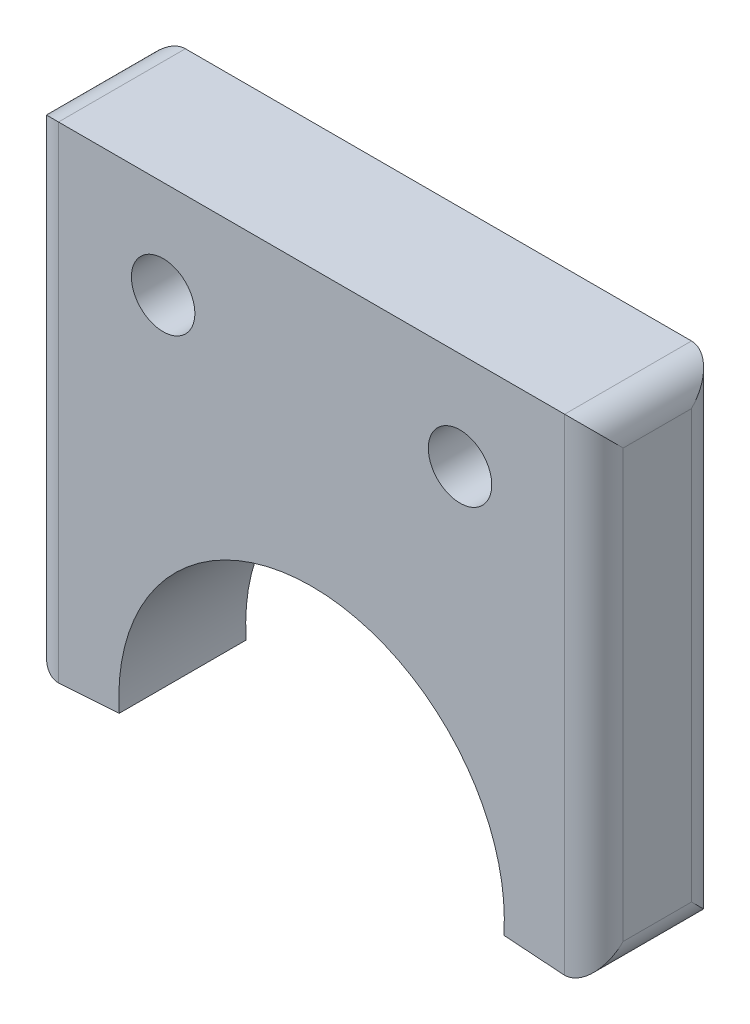
ISO-10303-21;
HEADER;
FILE_DESCRIPTION(('STEP AP214'),'2;1');
FILE_NAME('part.step','',(''),(''),'','','');
FILE_SCHEMA(('AUTOMOTIVE_DESIGN { 1 0 10303 214 1 1 1 1 }'));
ENDSEC;
DATA;
#1=APPLICATION_CONTEXT('core data for automotive mechanical design processes');
#2=APPLICATION_PROTOCOL_DEFINITION('international standard','automotive_design',2000,#1);
#3=PRODUCT_CONTEXT('',#1,'mechanical');
#4=PRODUCT('Part','Part','',(#3));
#5=PRODUCT_RELATED_PRODUCT_CATEGORY('part','',(#4));
#6=PRODUCT_DEFINITION_FORMATION('','',#4);
#7=PRODUCT_DEFINITION_CONTEXT('part definition',#1,'design');
#8=PRODUCT_DEFINITION('design','',#6,#7);
#9=PRODUCT_DEFINITION_SHAPE('','',#8);
#10=(LENGTH_UNIT() NAMED_UNIT(*) SI_UNIT(.MILLI.,.METRE.));
#11=(NAMED_UNIT(*) PLANE_ANGLE_UNIT() SI_UNIT($,.RADIAN.));
#12=(NAMED_UNIT(*) SI_UNIT($,.STERADIAN.) SOLID_ANGLE_UNIT());
#13=UNCERTAINTY_MEASURE_WITH_UNIT(LENGTH_MEASURE(1.E-05),#10,'distance_accuracy_value','');
#14=(GEOMETRIC_REPRESENTATION_CONTEXT(3) GLOBAL_UNCERTAINTY_ASSIGNED_CONTEXT((#13)) GLOBAL_UNIT_ASSIGNED_CONTEXT((#10,
#11,#12)) REPRESENTATION_CONTEXT('',''));
#15=CARTESIAN_POINT('',(0.,0.,0.));
#16=DIRECTION('',(0.,0.,1.));
#17=DIRECTION('',(1.,0.,0.));
#18=AXIS2_PLACEMENT_3D('',#15,#16,#17);
#19=CARTESIAN_POINT('',(0.,0.,13.));
#20=DIRECTION('',(0.,0.,1.));
#21=DIRECTION('',(1.,0.,0.));
#22=AXIS2_PLACEMENT_3D('',#19,#20,#21);
#23=PLANE('',#22);
#24=CARTESIAN_POINT('',(15.2099216455985,37.9770622614203,13.));
#25=DIRECTION('',(0.,0.,1.));
#26=DIRECTION('',(1.,0.,0.));
#27=AXIS2_PLACEMENT_3D('',#24,#25,#26);
#28=CIRCLE('',#27,3.25);
#29=CARTESIAN_POINT('',(11.9599216455985,37.9770622614203,13.));
#30=VERTEX_POINT('',#29);
#31=EDGE_CURVE('E236',#30,#30,#28,.T.);
#32=ORIENTED_EDGE('',*,*,#31,.F.);
#33=EDGE_LOOP('',(#32));
#34=FACE_BOUND('',#33,.T.);
#35=DIRECTION('',(-1.,0.,0.));
#36=VECTOR('',#35,1.);
#37=CARTESIAN_POINT('',(-28.9293574575349,47.9770622614203,13.));
#38=LINE('',#37,#36);
#39=CARTESIAN_POINT('',(25.9293574575349,47.9770622614203,13.));
#40=VERTEX_POINT('',#39);
#41=CARTESIAN_POINT('',(-25.9293574575349,47.9770622614203,13.));
#42=VERTEX_POINT('',#41);
#43=EDGE_CURVE('E133',#40,#42,#38,.T.);
#44=ORIENTED_EDGE('',*,*,#43,.T.);
#45=DIRECTION('',(0.,-1.,0.));
#46=VECTOR('',#45,1.);
#47=CARTESIAN_POINT('',(-25.9293574575349,-2.02293773857974,13.));
#48=LINE('',#47,#46);
#49=CARTESIAN_POINT('',(-25.9293574575349,-1.80583160850568,13.));
#50=VERTEX_POINT('',#49);
#51=EDGE_CURVE('E174',#42,#50,#48,.T.);
#52=ORIENTED_EDGE('',*,*,#51,.T.);
#53=CARTESIAN_POINT('',(-25.9293574575349,1.19416839149432,13.));
#54=DIRECTION('',(0.,0.,1.));
#55=DIRECTION('',(1.,0.,0.));
#56=AXIS2_PLACEMENT_3D('',#53,#54,#55);
#57=CIRCLE('',#56,3.);
#58=CARTESIAN_POINT('',(-25.7200880363025,-1.79852375928516,13.));
#59=VERTEX_POINT('',#58);
#60=EDGE_CURVE('E172',#50,#59,#57,.T.);
#61=ORIENTED_EDGE('',*,*,#60,.T.);
#62=DIRECTION('',(0.997564050259824,0.0697564737441291,0.));
#63=VECTOR('',#62,1.);
#64=CARTESIAN_POINT('',(-19.7018899926315,-1.37769035644655,13.));
#65=LINE('',#64,#63);
#66=CARTESIAN_POINT('',(-19.7018899926315,-1.37769035644655,13.));
#67=VERTEX_POINT('',#66);
#68=EDGE_CURVE('E140',#59,#67,#65,.T.);
#69=ORIENTED_EDGE('',*,*,#68,.T.);
#70=CARTESIAN_POINT('',(0.,0.,13.));
#71=DIRECTION('',(0.,0.,-1.));
#72=DIRECTION('',(1.,0.,0.));
#73=AXIS2_PLACEMENT_3D('',#70,#71,#72);
#74=CIRCLE('',#73,19.75);
#75=CARTESIAN_POINT('',(19.7018899926315,-1.37769035644655,13.));
#76=VERTEX_POINT('',#75);
#77=EDGE_CURVE('E134',#67,#76,#74,.T.);
#78=ORIENTED_EDGE('',*,*,#77,.T.);
#79=DIRECTION('',(0.997564050259824,-0.0697564737441291,0.));
#80=VECTOR('',#79,1.);
#81=CARTESIAN_POINT('',(19.7018899926315,-1.37769035644655,13.));
#82=LINE('',#81,#80);
#83=CARTESIAN_POINT('',(25.7200880363025,-1.79852375928516,13.));
#84=VERTEX_POINT('',#83);
#85=EDGE_CURVE('E124',#76,#84,#82,.T.);
#86=ORIENTED_EDGE('',*,*,#85,.T.);
#87=CARTESIAN_POINT('',(25.9293574575349,1.19416839149432,13.));
#88=DIRECTION('',(0.,0.,1.));
#89=DIRECTION('',(1.,0.,0.));
#90=AXIS2_PLACEMENT_3D('',#87,#88,#89);
#91=CIRCLE('',#90,3.);
#92=CARTESIAN_POINT('',(25.9293574575349,-1.80583160850568,13.));
#93=VERTEX_POINT('',#92);
#94=EDGE_CURVE('E170',#84,#93,#91,.T.);
#95=ORIENTED_EDGE('',*,*,#94,.T.);
#96=DIRECTION('',(0.,1.,0.));
#97=VECTOR('',#96,1.);
#98=CARTESIAN_POINT('',(25.9293574575349,47.9770622614203,13.));
#99=LINE('',#98,#97);
#100=EDGE_CURVE('E168',#93,#40,#99,.T.);
#101=ORIENTED_EDGE('',*,*,#100,.T.);
#102=EDGE_LOOP('',(#44,#52,#61,#69,#78,#86,#95,#101));
#103=FACE_BOUND('',#102,.T.);
#104=CARTESIAN_POINT('',(-15.2099216455985,37.9770622614203,13.));
#105=DIRECTION('',(0.,0.,1.));
#106=DIRECTION('',(-1.,0.,0.));
#107=AXIS2_PLACEMENT_3D('',#104,#105,#106);
#108=CIRCLE('',#107,3.25);
#109=CARTESIAN_POINT('',(-18.4599216455985,37.9770622614203,13.));
#110=VERTEX_POINT('',#109);
#111=EDGE_CURVE('E242',#110,#110,#108,.T.);
#112=ORIENTED_EDGE('',*,*,#111,.F.);
#113=EDGE_LOOP('',(#112));
#114=FACE_BOUND('',#113,.T.);
#115=ADVANCED_FACE('F33',(#34,#103,#114),#23,.T.);
#116=CARTESIAN_POINT('',(0.,0.,0.));
#117=DIRECTION('',(0.,0.,1.));
#118=DIRECTION('',(1.,0.,0.));
#119=AXIS2_PLACEMENT_3D('',#116,#117,#118);
#120=PLANE('',#119);
#121=DIRECTION('',(0.997564050259824,0.0697564737441291,0.));
#122=VECTOR('',#121,1.);
#123=CARTESIAN_POINT('',(-19.7018899926315,-1.37769035644655,0.));
#124=LINE('',#123,#122);
#125=CARTESIAN_POINT('',(-25.7200880363025,-1.79852375928516,0.));
#126=VERTEX_POINT('',#125);
#127=CARTESIAN_POINT('',(-19.7018899926315,-1.37769035644655,0.));
#128=VERTEX_POINT('',#127);
#129=EDGE_CURVE('E144',#126,#128,#124,.T.);
#130=ORIENTED_EDGE('',*,*,#129,.F.);
#131=CARTESIAN_POINT('',(-25.9293574575349,1.19416839149432,0.));
#132=DIRECTION('',(0.,0.,1.));
#133=DIRECTION('',(1.,0.,0.));
#134=AXIS2_PLACEMENT_3D('',#131,#132,#133);
#135=CIRCLE('',#134,3.);
#136=CARTESIAN_POINT('',(-25.9293574575349,-1.80583160850568,0.));
#137=VERTEX_POINT('',#136);
#138=EDGE_CURVE('E184',#126,#137,#135,.F.);
#139=ORIENTED_EDGE('',*,*,#138,.T.);
#140=DIRECTION('',(0.,-1.,0.));
#141=VECTOR('',#140,1.);
#142=CARTESIAN_POINT('',(-25.9293574575349,0.,0.));
#143=LINE('',#142,#141);
#144=CARTESIAN_POINT('',(-25.9293574575349,47.9770622614203,0.));
#145=VERTEX_POINT('',#144);
#146=EDGE_CURVE('E182',#137,#145,#143,.F.);
#147=ORIENTED_EDGE('',*,*,#146,.T.);
#148=DIRECTION('',(-1.,0.,0.));
#149=VECTOR('',#148,1.);
#150=CARTESIAN_POINT('',(-28.9293574575349,47.9770622614203,0.));
#151=LINE('',#150,#149);
#152=CARTESIAN_POINT('',(25.9293574575349,47.9770622614203,0.));
#153=VERTEX_POINT('',#152);
#154=EDGE_CURVE('E223',#153,#145,#151,.T.);
#155=ORIENTED_EDGE('',*,*,#154,.F.);
#156=DIRECTION('',(0.,1.,0.));
#157=VECTOR('',#156,1.);
#158=CARTESIAN_POINT('',(25.9293574575349,0.,0.));
#159=LINE('',#158,#157);
#160=CARTESIAN_POINT('',(25.9293574575349,-1.80583160850568,0.));
#161=VERTEX_POINT('',#160);
#162=EDGE_CURVE('E178',#153,#161,#159,.F.);
#163=ORIENTED_EDGE('',*,*,#162,.T.);
#164=CARTESIAN_POINT('',(25.9293574575349,1.19416839149432,0.));
#165=DIRECTION('',(0.,0.,1.));
#166=DIRECTION('',(1.,0.,0.));
#167=AXIS2_PLACEMENT_3D('',#164,#165,#166);
#168=CIRCLE('',#167,3.);
#169=CARTESIAN_POINT('',(25.7200880363025,-1.79852375928516,0.));
#170=VERTEX_POINT('',#169);
#171=EDGE_CURVE('E180',#161,#170,#168,.F.);
#172=ORIENTED_EDGE('',*,*,#171,.T.);
#173=DIRECTION('',(0.997564050259824,-0.0697564737441291,0.));
#174=VECTOR('',#173,1.);
#175=CARTESIAN_POINT('',(19.7018899926315,-1.37769035644655,0.));
#176=LINE('',#175,#174);
#177=CARTESIAN_POINT('',(19.7018899926315,-1.37769035644655,0.));
#178=VERTEX_POINT('',#177);
#179=EDGE_CURVE('E231',#178,#170,#176,.T.);
#180=ORIENTED_EDGE('',*,*,#179,.F.);
#181=CARTESIAN_POINT('',(0.,0.,0.));
#182=DIRECTION('',(0.,0.,-1.));
#183=DIRECTION('',(1.,0.,0.));
#184=AXIS2_PLACEMENT_3D('',#181,#182,#183);
#185=CIRCLE('',#184,19.75);
#186=EDGE_CURVE('E148',#128,#178,#185,.T.);
#187=ORIENTED_EDGE('',*,*,#186,.F.);
#188=EDGE_LOOP('',(#130,#139,#147,#155,#163,#172,#180,#187));
#189=FACE_BOUND('',#188,.T.);
#190=CARTESIAN_POINT('',(15.2099216455985,37.9770622614203,0.));
#191=DIRECTION('',(0.,0.,1.));
#192=DIRECTION('',(1.,0.,0.));
#193=AXIS2_PLACEMENT_3D('',#190,#191,#192);
#194=CIRCLE('',#193,3.25);
#195=CARTESIAN_POINT('',(11.9599216455985,37.9770622614203,0.));
#196=VERTEX_POINT('',#195);
#197=EDGE_CURVE('E239',#196,#196,#194,.T.);
#198=ORIENTED_EDGE('',*,*,#197,.T.);
#199=EDGE_LOOP('',(#198));
#200=FACE_BOUND('',#199,.T.);
#201=CARTESIAN_POINT('',(-15.2099216455985,37.9770622614203,0.));
#202=DIRECTION('',(0.,0.,1.));
#203=DIRECTION('',(-1.,0.,0.));
#204=AXIS2_PLACEMENT_3D('',#201,#202,#203);
#205=CIRCLE('',#204,3.25);
#206=CARTESIAN_POINT('',(-18.4599216455985,37.9770622614203,0.));
#207=VERTEX_POINT('',#206);
#208=EDGE_CURVE('E201',#207,#207,#205,.T.);
#209=ORIENTED_EDGE('',*,*,#208,.T.);
#210=EDGE_LOOP('',(#209));
#211=FACE_BOUND('',#210,.T.);
#212=ADVANCED_FACE('F227',(#189,#200,#211),#120,.F.);
#213=CARTESIAN_POINT('',(0.,0.,13.));
#214=DIRECTION('',(0.,0.,-1.));
#215=DIRECTION('',(-1.,0.,0.));
#216=AXIS2_PLACEMENT_3D('',#213,#214,#215);
#217=CYLINDRICAL_SURFACE('',#216,19.75);
#218=ORIENTED_EDGE('',*,*,#186,.T.);
#219=DIRECTION('',(0.,0.,-1.));
#220=VECTOR('',#219,1.);
#221=CARTESIAN_POINT('',(19.7018899926315,-1.37769035644655,13.));
#222=LINE('',#221,#220);
#223=EDGE_CURVE('E129',#76,#178,#222,.T.);
#224=ORIENTED_EDGE('',*,*,#223,.F.);
#225=ORIENTED_EDGE('',*,*,#77,.F.);
#226=DIRECTION('',(0.,0.,-1.));
#227=VECTOR('',#226,1.);
#228=CARTESIAN_POINT('',(-19.7018899926315,-1.37769035644655,13.));
#229=LINE('',#228,#227);
#230=EDGE_CURVE('E150',#67,#128,#229,.T.);
#231=ORIENTED_EDGE('',*,*,#230,.T.);
#232=EDGE_LOOP('',(#218,#224,#225,#231));
#233=FACE_BOUND('',#232,.T.);
#234=ADVANCED_FACE('F146',(#233),#217,.F.);
#235=CARTESIAN_POINT('',(19.7018899926315,-1.37769035644655,13.));
#236=DIRECTION('',(0.0697564737441291,0.997564050259824,0.));
#237=DIRECTION('',(-0.997564050259824,0.0697564737441291,0.));
#238=AXIS2_PLACEMENT_3D('',#235,#236,#237);
#239=PLANE('',#238);
#240=ORIENTED_EDGE('',*,*,#179,.T.);
#241=DIRECTION('',(0.,0.,-1.));
#242=VECTOR('',#241,1.);
#243=CARTESIAN_POINT('',(25.7200880363025,-1.79852375928516,13.));
#244=LINE('',#243,#242);
#245=EDGE_CURVE('E11',#170,#84,#244,.F.);
#246=ORIENTED_EDGE('',*,*,#245,.T.);
#247=ORIENTED_EDGE('',*,*,#85,.F.);
#248=ORIENTED_EDGE('',*,*,#223,.T.);
#249=EDGE_LOOP('',(#240,#246,#247,#248));
#250=FACE_BOUND('',#249,.T.);
#251=ADVANCED_FACE('F127',(#250),#239,.F.);
#252=CARTESIAN_POINT('',(28.9293574575349,-2.02293773857974,13.));
#253=DIRECTION('',(-1.,0.,0.));
#254=DIRECTION('',(0.,0.,1.));
#255=AXIS2_PLACEMENT_3D('',#252,#253,#254);
#256=PLANE('',#255);
#257=DIRECTION('',(0.,1.,0.));
#258=VECTOR('',#257,1.);
#259=CARTESIAN_POINT('',(28.9293574575349,-2.02293773857974,10.));
#260=LINE('',#259,#258);
#261=CARTESIAN_POINT('',(28.9293574575349,44.9770622614203,10.));
#262=VERTEX_POINT('',#261);
#263=CARTESIAN_POINT('',(28.9293574575349,1.19416839149432,10.));
#264=VERTEX_POINT('',#263);
#265=EDGE_CURVE('E50',#262,#264,#260,.F.);
#266=ORIENTED_EDGE('',*,*,#265,.T.);
#267=DIRECTION('',(0.,0.,-1.));
#268=VECTOR('',#267,1.);
#269=CARTESIAN_POINT('',(28.9293574575349,1.19416839149432,13.));
#270=LINE('',#269,#268);
#271=CARTESIAN_POINT('',(28.9293574575349,1.19416839149432,3.));
#272=VERTEX_POINT('',#271);
#273=EDGE_CURVE('E42',#264,#272,#270,.T.);
#274=ORIENTED_EDGE('',*,*,#273,.T.);
#275=DIRECTION('',(0.,1.,0.));
#276=VECTOR('',#275,1.);
#277=CARTESIAN_POINT('',(28.9293574575349,-2.02293773857974,3.));
#278=LINE('',#277,#276);
#279=CARTESIAN_POINT('',(28.9293574575349,44.9770622614203,3.));
#280=VERTEX_POINT('',#279);
#281=EDGE_CURVE('E186',#272,#280,#278,.T.);
#282=ORIENTED_EDGE('',*,*,#281,.T.);
#283=DIRECTION('',(0.,0.,-1.));
#284=VECTOR('',#283,1.);
#285=CARTESIAN_POINT('',(28.9293574575349,44.9770622614203,13.));
#286=LINE('',#285,#284);
#287=EDGE_CURVE('E55',#280,#262,#286,.F.);
#288=ORIENTED_EDGE('',*,*,#287,.T.);
#289=EDGE_LOOP('',(#266,#274,#282,#288));
#290=FACE_BOUND('',#289,.T.);
#291=ADVANCED_FACE('F274',(#290),#256,.F.);
#292=CARTESIAN_POINT('',(-28.9293574575349,47.9770622614203,13.));
#293=DIRECTION('',(0.,-1.,0.));
#294=DIRECTION('',(0.,0.,-1.));
#295=AXIS2_PLACEMENT_3D('',#292,#293,#294);
#296=PLANE('',#295);
#297=ORIENTED_EDGE('',*,*,#154,.T.);
#298=DIRECTION('',(0.,0.,-1.));
#299=VECTOR('',#298,1.);
#300=CARTESIAN_POINT('',(-25.9293574575349,47.9770622614203,13.));
#301=LINE('',#300,#299);
#302=EDGE_CURVE('E165',#145,#42,#301,.F.);
#303=ORIENTED_EDGE('',*,*,#302,.T.);
#304=ORIENTED_EDGE('',*,*,#43,.F.);
#305=DIRECTION('',(0.,0.,-1.));
#306=VECTOR('',#305,1.);
#307=CARTESIAN_POINT('',(25.9293574575349,47.9770622614203,13.));
#308=LINE('',#307,#306);
#309=EDGE_CURVE('E163',#40,#153,#308,.T.);
#310=ORIENTED_EDGE('',*,*,#309,.T.);
#311=EDGE_LOOP('',(#297,#303,#304,#310));
#312=FACE_BOUND('',#311,.T.);
#313=ADVANCED_FACE('F222',(#312),#296,.F.);
#314=CARTESIAN_POINT('',(-28.9293574575349,-2.02293773857974,13.));
#315=DIRECTION('',(1.,0.,0.));
#316=DIRECTION('',(0.,0.,-1.));
#317=AXIS2_PLACEMENT_3D('',#314,#315,#316);
#318=PLANE('',#317);
#319=DIRECTION('',(0.,-1.,0.));
#320=VECTOR('',#319,1.);
#321=CARTESIAN_POINT('',(-28.9293574575349,47.9770622614203,10.));
#322=LINE('',#321,#320);
#323=CARTESIAN_POINT('',(-28.9293574575349,1.19416839149432,10.));
#324=VERTEX_POINT('',#323);
#325=CARTESIAN_POINT('',(-28.9293574575349,44.9770622614203,10.));
#326=VERTEX_POINT('',#325);
#327=EDGE_CURVE('E158',#324,#326,#322,.F.);
#328=ORIENTED_EDGE('',*,*,#327,.T.);
#329=DIRECTION('',(0.,0.,-1.));
#330=VECTOR('',#329,1.);
#331=CARTESIAN_POINT('',(-28.9293574575349,44.9770622614203,13.));
#332=LINE('',#331,#330);
#333=CARTESIAN_POINT('',(-28.9293574575349,44.9770622614203,3.));
#334=VERTEX_POINT('',#333);
#335=EDGE_CURVE('E160',#326,#334,#332,.T.);
#336=ORIENTED_EDGE('',*,*,#335,.T.);
#337=DIRECTION('',(0.,-1.,0.));
#338=VECTOR('',#337,1.);
#339=CARTESIAN_POINT('',(-28.9293574575349,-2.02293773857974,3.));
#340=LINE('',#339,#338);
#341=CARTESIAN_POINT('',(-28.9293574575349,1.19416839149432,3.));
#342=VERTEX_POINT('',#341);
#343=EDGE_CURVE('E149',#334,#342,#340,.T.);
#344=ORIENTED_EDGE('',*,*,#343,.T.);
#345=DIRECTION('',(0.,0.,-1.));
#346=VECTOR('',#345,1.);
#347=CARTESIAN_POINT('',(-28.9293574575349,1.19416839149432,13.));
#348=LINE('',#347,#346);
#349=EDGE_CURVE('E152',#342,#324,#348,.F.);
#350=ORIENTED_EDGE('',*,*,#349,.T.);
#351=EDGE_LOOP('',(#328,#336,#344,#350));
#352=FACE_BOUND('',#351,.T.);
#353=ADVANCED_FACE('F267',(#352),#318,.F.);
#354=CARTESIAN_POINT('',(-19.7018899926315,-1.37769035644655,13.));
#355=DIRECTION('',(-0.0697564737441291,0.997564050259824,0.));
#356=DIRECTION('',(-0.997564050259824,-0.0697564737441291,0.));
#357=AXIS2_PLACEMENT_3D('',#354,#355,#356);
#358=PLANE('',#357);
#359=ORIENTED_EDGE('',*,*,#68,.F.);
#360=DIRECTION('',(0.,0.,-1.));
#361=VECTOR('',#360,1.);
#362=CARTESIAN_POINT('',(-25.7200880363025,-1.79852375928516,13.));
#363=LINE('',#362,#361);
#364=EDGE_CURVE('E176',#59,#126,#363,.T.);
#365=ORIENTED_EDGE('',*,*,#364,.T.);
#366=ORIENTED_EDGE('',*,*,#129,.T.);
#367=ORIENTED_EDGE('',*,*,#230,.F.);
#368=EDGE_LOOP('',(#359,#365,#366,#367));
#369=FACE_BOUND('',#368,.T.);
#370=ADVANCED_FACE('F264',(#369),#358,.F.);
#371=CARTESIAN_POINT('',(15.2099216455985,37.9770622614203,13.));
#372=DIRECTION('',(0.,0.,-1.));
#373=DIRECTION('',(-1.,0.,0.));
#374=AXIS2_PLACEMENT_3D('',#371,#372,#373);
#375=CYLINDRICAL_SURFACE('',#374,3.25);
#376=CARTESIAN_POINT('',(11.9599216455985,37.9770622614203,13.));
#377=CARTESIAN_POINT('',(11.9599216455985,37.9770622614203,12.8645833333333));
#378=CARTESIAN_POINT('',(11.9599216455985,37.9770622614203,12.7291666666667));
#379=CARTESIAN_POINT('',(11.9599216455985,37.9770622614203,12.4583333333333));
#380=CARTESIAN_POINT('',(11.9599216455985,37.9770622614203,12.3229166666667));
#381=CARTESIAN_POINT('',(11.9599216455985,37.9770622614203,12.0520833333333));
#382=CARTESIAN_POINT('',(11.9599216455985,37.9770622614203,11.9166666666667));
#383=CARTESIAN_POINT('',(11.9599216455985,37.9770622614203,11.6458333333333));
#384=CARTESIAN_POINT('',(11.9599216455985,37.9770622614203,11.5104166666667));
#385=CARTESIAN_POINT('',(11.9599216455985,37.9770622614203,11.2395833333333));
#386=CARTESIAN_POINT('',(11.9599216455985,37.9770622614203,11.1041666666667));
#387=CARTESIAN_POINT('',(11.9599216455985,37.9770622614203,10.8333333333333));
#388=CARTESIAN_POINT('',(11.9599216455985,37.9770622614203,10.6979166666667));
#389=CARTESIAN_POINT('',(11.9599216455985,37.9770622614203,10.4270833333333));
#390=CARTESIAN_POINT('',(11.9599216455985,37.9770622614203,10.2916666666667));
#391=CARTESIAN_POINT('',(11.9599216455985,37.9770622614203,10.0208333333333));
#392=CARTESIAN_POINT('',(11.9599216455985,37.9770622614203,9.88541666666667));
#393=CARTESIAN_POINT('',(11.9599216455985,37.9770622614203,9.61458333333333));
#394=CARTESIAN_POINT('',(11.9599216455985,37.9770622614203,9.47916666666667));
#395=CARTESIAN_POINT('',(11.9599216455985,37.9770622614203,9.20833333333333));
#396=CARTESIAN_POINT('',(11.9599216455985,37.9770622614203,9.07291666666667));
#397=CARTESIAN_POINT('',(11.9599216455985,37.9770622614203,8.80208333333333));
#398=CARTESIAN_POINT('',(11.9599216455985,37.9770622614203,8.66666666666667));
#399=CARTESIAN_POINT('',(11.9599216455985,37.9770622614203,8.39583333333333));
#400=CARTESIAN_POINT('',(11.9599216455985,37.9770622614203,8.26041666666667));
#401=CARTESIAN_POINT('',(11.9599216455985,37.9770622614203,7.98958333333333));
#402=CARTESIAN_POINT('',(11.9599216455985,37.9770622614203,7.85416666666667));
#403=CARTESIAN_POINT('',(11.9599216455985,37.9770622614203,7.58333333333333));
#404=CARTESIAN_POINT('',(11.9599216455985,37.9770622614203,7.44791666666667));
#405=CARTESIAN_POINT('',(11.9599216455985,37.9770622614203,7.17708333333333));
#406=CARTESIAN_POINT('',(11.9599216455985,37.9770622614203,7.04166666666667));
#407=CARTESIAN_POINT('',(11.9599216455985,37.9770622614203,6.77083333333333));
#408=CARTESIAN_POINT('',(11.9599216455985,37.9770622614203,6.63541666666667));
#409=CARTESIAN_POINT('',(11.9599216455985,37.9770622614203,6.36458333333333));
#410=CARTESIAN_POINT('',(11.9599216455985,37.9770622614203,6.22916666666667));
#411=CARTESIAN_POINT('',(11.9599216455985,37.9770622614203,5.95833333333333));
#412=CARTESIAN_POINT('',(11.9599216455985,37.9770622614203,5.82291666666667));
#413=CARTESIAN_POINT('',(11.9599216455985,37.9770622614203,5.55208333333333));
#414=CARTESIAN_POINT('',(11.9599216455985,37.9770622614203,5.41666666666667));
#415=CARTESIAN_POINT('',(11.9599216455985,37.9770622614203,5.14583333333333));
#416=CARTESIAN_POINT('',(11.9599216455985,37.9770622614203,5.01041666666667));
#417=CARTESIAN_POINT('',(11.9599216455985,37.9770622614203,4.73958333333333));
#418=CARTESIAN_POINT('',(11.9599216455985,37.9770622614203,4.60416666666667));
#419=CARTESIAN_POINT('',(11.9599216455985,37.9770622614203,4.33333333333333));
#420=CARTESIAN_POINT('',(11.9599216455985,37.9770622614203,4.19791666666667));
#421=CARTESIAN_POINT('',(11.9599216455985,37.9770622614203,3.92708333333333));
#422=CARTESIAN_POINT('',(11.9599216455985,37.9770622614203,3.79166666666667));
#423=CARTESIAN_POINT('',(11.9599216455985,37.9770622614203,3.52083333333333));
#424=CARTESIAN_POINT('',(11.9599216455985,37.9770622614203,3.38541666666667));
#425=CARTESIAN_POINT('',(11.9599216455985,37.9770622614203,3.11458333333333));
#426=CARTESIAN_POINT('',(11.9599216455985,37.9770622614203,2.97916666666667));
#427=CARTESIAN_POINT('',(11.9599216455985,37.9770622614203,2.70833333333333));
#428=CARTESIAN_POINT('',(11.9599216455985,37.9770622614203,2.57291666666667));
#429=CARTESIAN_POINT('',(11.9599216455985,37.9770622614203,2.30208333333333));
#430=CARTESIAN_POINT('',(11.9599216455985,37.9770622614203,2.16666666666667));
#431=CARTESIAN_POINT('',(11.9599216455985,37.9770622614203,1.89583333333333));
#432=CARTESIAN_POINT('',(11.9599216455985,37.9770622614203,1.76041666666667));
#433=CARTESIAN_POINT('',(11.9599216455985,37.9770622614203,1.48958333333333));
#434=CARTESIAN_POINT('',(11.9599216455985,37.9770622614203,1.35416666666667));
#435=CARTESIAN_POINT('',(11.9599216455985,37.9770622614203,1.08333333333333));
#436=CARTESIAN_POINT('',(11.9599216455985,37.9770622614203,0.947916666666667));
#437=CARTESIAN_POINT('',(11.9599216455985,37.9770622614203,0.677083333333334));
#438=CARTESIAN_POINT('',(11.9599216455985,37.9770622614203,0.541666666666667));
#439=CARTESIAN_POINT('',(11.9599216455985,37.9770622614203,0.270833333333334));
#440=CARTESIAN_POINT('',(11.9599216455985,37.9770622614203,0.135416666666667));
#441=CARTESIAN_POINT('',(11.9599216455985,37.9770622614203,0.));
#442=B_SPLINE_CURVE_WITH_KNOTS('',3,(#376,#377,#378,#379,#380,#381,#382,#383,#384,#385,#386,
#387,#388,#389,#390,#391,#392,#393,#394,#395,#396,#397,#398,#399,#400,#401,#402,#403,#404,#405,
#406,#407,#408,#409,#410,#411,#412,#413,#414,#415,#416,#417,#418,#419,#420,#421,#422,#423,#424,
#425,#426,#427,#428,#429,#430,#431,#432,#433,#434,#435,#436,#437,#438,#439,#440,#441),
.UNSPECIFIED.,.F.,.F.,(4,2,2,2,2,2,2,2,2,2,2,2,2,2,2,2,2,2,2,2,2,2,2,2,2,2,2,2,2,2,2,2,4),(0.,
0.406249999999999,0.812499999999999,1.21875,1.625,2.03125,2.4375,2.84375,3.25,3.65625,4.0625,
4.46875,4.875,5.28125,5.6875,6.09375,6.5,6.90625,7.3125,7.71875,8.125,8.53125,8.9375,9.34375,
9.75,10.15625,10.5625,10.96875,11.375,11.78125,12.1875,12.59375,13.),.UNSPECIFIED.);
#443=EDGE_CURVE('BSEAM261',#30,#196,#442,.T.);
#444=ORIENTED_EDGE('',*,*,#31,.T.);
#445=ORIENTED_EDGE('',*,*,#197,.F.);
#446=ORIENTED_EDGE('',*,*,#443,.T.);
#447=ORIENTED_EDGE('',*,*,#443,.F.);
#448=EDGE_LOOP('',(#444,#446,#445,#447));
#449=FACE_BOUND('',#448,.T.);
#450=ADVANCED_FACE('F261',(#449),#375,.F.);
#451=CARTESIAN_POINT('',(-15.2099216455985,37.9770622614203,13.));
#452=DIRECTION('',(0.,0.,-1.));
#453=DIRECTION('',(-1.,0.,0.));
#454=AXIS2_PLACEMENT_3D('',#451,#452,#453);
#455=CYLINDRICAL_SURFACE('',#454,3.25);
#456=CARTESIAN_POINT('',(-18.4599216455985,37.9770622614203,13.));
#457=CARTESIAN_POINT('',(-18.4599216455985,37.9770622614203,12.8645833333333));
#458=CARTESIAN_POINT('',(-18.4599216455985,37.9770622614203,12.7291666666667));
#459=CARTESIAN_POINT('',(-18.4599216455985,37.9770622614203,12.4583333333333));
#460=CARTESIAN_POINT('',(-18.4599216455985,37.9770622614203,12.3229166666667));
#461=CARTESIAN_POINT('',(-18.4599216455985,37.9770622614203,12.0520833333333));
#462=CARTESIAN_POINT('',(-18.4599216455985,37.9770622614203,11.9166666666667));
#463=CARTESIAN_POINT('',(-18.4599216455985,37.9770622614203,11.6458333333333));
#464=CARTESIAN_POINT('',(-18.4599216455985,37.9770622614203,11.5104166666667));
#465=CARTESIAN_POINT('',(-18.4599216455985,37.9770622614203,11.2395833333333));
#466=CARTESIAN_POINT('',(-18.4599216455985,37.9770622614203,11.1041666666667));
#467=CARTESIAN_POINT('',(-18.4599216455985,37.9770622614203,10.8333333333333));
#468=CARTESIAN_POINT('',(-18.4599216455985,37.9770622614203,10.6979166666667));
#469=CARTESIAN_POINT('',(-18.4599216455985,37.9770622614203,10.4270833333333));
#470=CARTESIAN_POINT('',(-18.4599216455985,37.9770622614203,10.2916666666667));
#471=CARTESIAN_POINT('',(-18.4599216455985,37.9770622614203,10.0208333333333));
#472=CARTESIAN_POINT('',(-18.4599216455985,37.9770622614203,9.88541666666667));
#473=CARTESIAN_POINT('',(-18.4599216455985,37.9770622614203,9.61458333333333));
#474=CARTESIAN_POINT('',(-18.4599216455985,37.9770622614203,9.47916666666667));
#475=CARTESIAN_POINT('',(-18.4599216455985,37.9770622614203,9.20833333333333));
#476=CARTESIAN_POINT('',(-18.4599216455985,37.9770622614203,9.07291666666667));
#477=CARTESIAN_POINT('',(-18.4599216455985,37.9770622614203,8.80208333333333));
#478=CARTESIAN_POINT('',(-18.4599216455985,37.9770622614203,8.66666666666667));
#479=CARTESIAN_POINT('',(-18.4599216455985,37.9770622614203,8.39583333333333));
#480=CARTESIAN_POINT('',(-18.4599216455985,37.9770622614203,8.26041666666667));
#481=CARTESIAN_POINT('',(-18.4599216455985,37.9770622614203,7.98958333333333));
#482=CARTESIAN_POINT('',(-18.4599216455985,37.9770622614203,7.85416666666667));
#483=CARTESIAN_POINT('',(-18.4599216455985,37.9770622614203,7.58333333333333));
#484=CARTESIAN_POINT('',(-18.4599216455985,37.9770622614203,7.44791666666667));
#485=CARTESIAN_POINT('',(-18.4599216455985,37.9770622614203,7.17708333333333));
#486=CARTESIAN_POINT('',(-18.4599216455985,37.9770622614203,7.04166666666667));
#487=CARTESIAN_POINT('',(-18.4599216455985,37.9770622614203,6.77083333333333));
#488=CARTESIAN_POINT('',(-18.4599216455985,37.9770622614203,6.63541666666667));
#489=CARTESIAN_POINT('',(-18.4599216455985,37.9770622614203,6.36458333333333));
#490=CARTESIAN_POINT('',(-18.4599216455985,37.9770622614203,6.22916666666667));
#491=CARTESIAN_POINT('',(-18.4599216455985,37.9770622614203,5.95833333333333));
#492=CARTESIAN_POINT('',(-18.4599216455985,37.9770622614203,5.82291666666667));
#493=CARTESIAN_POINT('',(-18.4599216455985,37.9770622614203,5.55208333333333));
#494=CARTESIAN_POINT('',(-18.4599216455985,37.9770622614203,5.41666666666667));
#495=CARTESIAN_POINT('',(-18.4599216455985,37.9770622614203,5.14583333333333));
#496=CARTESIAN_POINT('',(-18.4599216455985,37.9770622614203,5.01041666666667));
#497=CARTESIAN_POINT('',(-18.4599216455985,37.9770622614203,4.73958333333333));
#498=CARTESIAN_POINT('',(-18.4599216455985,37.9770622614203,4.60416666666667));
#499=CARTESIAN_POINT('',(-18.4599216455985,37.9770622614203,4.33333333333333));
#500=CARTESIAN_POINT('',(-18.4599216455985,37.9770622614203,4.19791666666667));
#501=CARTESIAN_POINT('',(-18.4599216455985,37.9770622614203,3.92708333333333));
#502=CARTESIAN_POINT('',(-18.4599216455985,37.9770622614203,3.79166666666667));
#503=CARTESIAN_POINT('',(-18.4599216455985,37.9770622614203,3.52083333333333));
#504=CARTESIAN_POINT('',(-18.4599216455985,37.9770622614203,3.38541666666667));
#505=CARTESIAN_POINT('',(-18.4599216455985,37.9770622614203,3.11458333333333));
#506=CARTESIAN_POINT('',(-18.4599216455985,37.9770622614203,2.97916666666667));
#507=CARTESIAN_POINT('',(-18.4599216455985,37.9770622614203,2.70833333333333));
#508=CARTESIAN_POINT('',(-18.4599216455985,37.9770622614203,2.57291666666667));
#509=CARTESIAN_POINT('',(-18.4599216455985,37.9770622614203,2.30208333333333));
#510=CARTESIAN_POINT('',(-18.4599216455985,37.9770622614203,2.16666666666667));
#511=CARTESIAN_POINT('',(-18.4599216455985,37.9770622614203,1.89583333333333));
#512=CARTESIAN_POINT('',(-18.4599216455985,37.9770622614203,1.76041666666667));
#513=CARTESIAN_POINT('',(-18.4599216455985,37.9770622614203,1.48958333333333));
#514=CARTESIAN_POINT('',(-18.4599216455985,37.9770622614203,1.35416666666667));
#515=CARTESIAN_POINT('',(-18.4599216455985,37.9770622614203,1.08333333333333));
#516=CARTESIAN_POINT('',(-18.4599216455985,37.9770622614203,0.947916666666667));
#517=CARTESIAN_POINT('',(-18.4599216455985,37.9770622614203,0.677083333333334));
#518=CARTESIAN_POINT('',(-18.4599216455985,37.9770622614203,0.541666666666667));
#519=CARTESIAN_POINT('',(-18.4599216455985,37.9770622614203,0.270833333333334));
#520=CARTESIAN_POINT('',(-18.4599216455985,37.9770622614203,0.135416666666667));
#521=CARTESIAN_POINT('',(-18.4599216455985,37.9770622614203,0.));
#522=B_SPLINE_CURVE_WITH_KNOTS('',3,(#456,#457,#458,#459,#460,#461,#462,#463,#464,#465,#466,
#467,#468,#469,#470,#471,#472,#473,#474,#475,#476,#477,#478,#479,#480,#481,#482,#483,#484,#485,
#486,#487,#488,#489,#490,#491,#492,#493,#494,#495,#496,#497,#498,#499,#500,#501,#502,#503,#504,
#505,#506,#507,#508,#509,#510,#511,#512,#513,#514,#515,#516,#517,#518,#519,#520,#521),
.UNSPECIFIED.,.F.,.F.,(4,2,2,2,2,2,2,2,2,2,2,2,2,2,2,2,2,2,2,2,2,2,2,2,2,2,2,2,2,2,2,2,4),(0.,
0.406249999999999,0.812499999999999,1.21875,1.625,2.03125,2.4375,2.84375,3.25,3.65625,4.0625,
4.46875,4.875,5.28125,5.6875,6.09375,6.5,6.90625,7.3125,7.71875,8.125,8.53125,8.9375,9.34375,
9.75,10.15625,10.5625,10.96875,11.375,11.78125,12.1875,12.59375,13.),.UNSPECIFIED.);
#523=EDGE_CURVE('BSEAM250',#110,#207,#522,.T.);
#524=ORIENTED_EDGE('',*,*,#111,.T.);
#525=ORIENTED_EDGE('',*,*,#208,.F.);
#526=ORIENTED_EDGE('',*,*,#523,.T.);
#527=ORIENTED_EDGE('',*,*,#523,.F.);
#528=EDGE_LOOP('',(#524,#526,#525,#527));
#529=FACE_BOUND('',#528,.T.);
#530=ADVANCED_FACE('F250',(#529),#455,.F.);
#531=CARTESIAN_POINT('',(-25.9293574575349,1.19416839149432,13.));
#532=DIRECTION('',(0.,0.,-1.));
#533=DIRECTION('',(-1.,0.,0.));
#534=AXIS2_PLACEMENT_3D('',#531,#532,#533);
#535=CYLINDRICAL_SURFACE('',#534,3.);
#536=ORIENTED_EDGE('',*,*,#364,.F.);
#537=ORIENTED_EDGE('',*,*,#60,.F.);
#538=CARTESIAN_POINT('',(-25.9293574575349,1.19416839149432,10.));
#539=DIRECTION('',(0.,-0.707106781186547,-0.707106781186547));
#540=DIRECTION('',(0.,0.707106781186547,-0.707106781186547));
#541=AXIS2_PLACEMENT_3D('',#538,#539,#540);
#542=ELLIPSE('',#541,4.24264068711928,3.);
#543=EDGE_CURVE('E198',#324,#50,#542,.F.);
#544=ORIENTED_EDGE('',*,*,#543,.F.);
#545=ORIENTED_EDGE('',*,*,#349,.F.);
#546=CARTESIAN_POINT('',(-25.9293574575349,1.19416839149432,3.));
#547=DIRECTION('',(0.,-0.707106781186547,0.707106781186547));
#548=DIRECTION('',(0.,-0.707106781186547,-0.707106781186547));
#549=AXIS2_PLACEMENT_3D('',#546,#547,#548);
#550=ELLIPSE('',#549,4.24264068711928,3.);
#551=EDGE_CURVE('E195',#137,#342,#550,.F.);
#552=ORIENTED_EDGE('',*,*,#551,.F.);
#553=ORIENTED_EDGE('',*,*,#138,.F.);
#554=EDGE_LOOP('',(#536,#537,#544,#545,#552,#553));
#555=FACE_BOUND('',#554,.T.);
#556=ADVANCED_FACE('F292',(#555),#535,.T.);
#557=CARTESIAN_POINT('',(-25.9293574575349,0.,10.));
#558=DIRECTION('',(0.,1.,0.));
#559=DIRECTION('',(0.,0.,1.));
#560=AXIS2_PLACEMENT_3D('',#557,#558,#559);
#561=CYLINDRICAL_SURFACE('',#560,3.);
#562=ORIENTED_EDGE('',*,*,#543,.T.);
#563=ORIENTED_EDGE('',*,*,#51,.F.);
#564=CARTESIAN_POINT('',(-25.9293574575349,44.9770622614203,10.));
#565=DIRECTION('',(0.,0.707106781186547,-0.707106781186547));
#566=DIRECTION('',(0.,0.707106781186547,0.707106781186547));
#567=AXIS2_PLACEMENT_3D('',#564,#565,#566);
#568=ELLIPSE('',#567,4.24264068711928,3.);
#569=EDGE_CURVE('E193',#326,#42,#568,.T.);
#570=ORIENTED_EDGE('',*,*,#569,.F.);
#571=ORIENTED_EDGE('',*,*,#327,.F.);
#572=EDGE_LOOP('',(#562,#563,#570,#571));
#573=FACE_BOUND('',#572,.T.);
#574=ADVANCED_FACE('F288',(#573),#561,.T.);
#575=CARTESIAN_POINT('',(-25.9293574575349,-2.02293773857974,3.));
#576=DIRECTION('',(0.,-1.,0.));
#577=DIRECTION('',(0.,0.,-1.));
#578=AXIS2_PLACEMENT_3D('',#575,#576,#577);
#579=CYLINDRICAL_SURFACE('',#578,3.);
#580=ORIENTED_EDGE('',*,*,#551,.T.);
#581=ORIENTED_EDGE('',*,*,#343,.F.);
#582=CARTESIAN_POINT('',(-25.9293574575349,44.9770622614203,3.));
#583=DIRECTION('',(0.,-0.707106781186547,-0.707106781186547));
#584=DIRECTION('',(0.,-0.707106781186547,0.707106781186547));
#585=AXIS2_PLACEMENT_3D('',#582,#583,#584);
#586=ELLIPSE('',#585,4.24264068711928,3.);
#587=EDGE_CURVE('E191',#145,#334,#586,.F.);
#588=ORIENTED_EDGE('',*,*,#587,.F.);
#589=ORIENTED_EDGE('',*,*,#146,.F.);
#590=EDGE_LOOP('',(#580,#581,#588,#589));
#591=FACE_BOUND('',#590,.T.);
#592=ADVANCED_FACE('F284',(#591),#579,.T.);
#593=CARTESIAN_POINT('',(-25.9293574575349,44.9770622614203,13.));
#594=DIRECTION('',(0.,0.,-1.));
#595=DIRECTION('',(-1.,0.,0.));
#596=AXIS2_PLACEMENT_3D('',#593,#594,#595);
#597=CYLINDRICAL_SURFACE('',#596,3.);
#598=ORIENTED_EDGE('',*,*,#569,.T.);
#599=ORIENTED_EDGE('',*,*,#302,.F.);
#600=ORIENTED_EDGE('',*,*,#587,.T.);
#601=ORIENTED_EDGE('',*,*,#335,.F.);
#602=EDGE_LOOP('',(#598,#599,#600,#601));
#603=FACE_BOUND('',#602,.T.);
#604=ADVANCED_FACE('F281',(#603),#597,.T.);
#605=CARTESIAN_POINT('',(25.9293574575349,44.9770622614203,13.));
#606=DIRECTION('',(0.,0.,-1.));
#607=DIRECTION('',(-1.,0.,0.));
#608=AXIS2_PLACEMENT_3D('',#605,#606,#607);
#609=CYLINDRICAL_SURFACE('',#608,3.);
#610=CARTESIAN_POINT('',(25.9293574575349,44.9770622614203,3.));
#611=DIRECTION('',(0.,0.707106781186547,0.707106781186547));
#612=DIRECTION('',(0.,0.707106781186547,-0.707106781186547));
#613=AXIS2_PLACEMENT_3D('',#610,#611,#612);
#614=ELLIPSE('',#613,4.24264068711928,3.);
#615=EDGE_CURVE('E206',#153,#280,#614,.F.);
#616=ORIENTED_EDGE('',*,*,#615,.F.);
#617=ORIENTED_EDGE('',*,*,#309,.F.);
#618=CARTESIAN_POINT('',(25.9293574575349,44.9770622614203,10.));
#619=DIRECTION('',(0.,0.707106781186547,-0.707106781186547));
#620=DIRECTION('',(0.,-0.707106781186547,-0.707106781186547));
#621=AXIS2_PLACEMENT_3D('',#618,#619,#620);
#622=ELLIPSE('',#621,4.24264068711928,3.);
#623=EDGE_CURVE('E37',#262,#40,#622,.F.);
#624=ORIENTED_EDGE('',*,*,#623,.F.);
#625=ORIENTED_EDGE('',*,*,#287,.F.);
#626=EDGE_LOOP('',(#616,#617,#624,#625));
#627=FACE_BOUND('',#626,.T.);
#628=ADVANCED_FACE('F35',(#627),#609,.T.);
#629=CARTESIAN_POINT('',(25.9293574575349,0.,10.));
#630=DIRECTION('',(0.,-1.,0.));
#631=DIRECTION('',(0.,0.,-1.));
#632=AXIS2_PLACEMENT_3D('',#629,#630,#631);
#633=CYLINDRICAL_SURFACE('',#632,3.);
#634=ORIENTED_EDGE('',*,*,#623,.T.);
#635=ORIENTED_EDGE('',*,*,#100,.F.);
#636=CARTESIAN_POINT('',(25.9293574575349,1.19416839149432,10.));
#637=DIRECTION('',(0.,-0.707106781186547,-0.707106781186547));
#638=DIRECTION('',(0.,-0.707106781186547,0.707106781186547));
#639=AXIS2_PLACEMENT_3D('',#636,#637,#638);
#640=ELLIPSE('',#639,4.24264068711928,3.);
#641=EDGE_CURVE('E204',#264,#93,#640,.T.);
#642=ORIENTED_EDGE('',*,*,#641,.F.);
#643=ORIENTED_EDGE('',*,*,#265,.F.);
#644=EDGE_LOOP('',(#634,#635,#642,#643));
#645=FACE_BOUND('',#644,.T.);
#646=ADVANCED_FACE('F215',(#645),#633,.T.);
#647=CARTESIAN_POINT('',(25.9293574575349,-2.02293773857974,3.));
#648=DIRECTION('',(0.,1.,0.));
#649=DIRECTION('',(0.,0.,1.));
#650=AXIS2_PLACEMENT_3D('',#647,#648,#649);
#651=CYLINDRICAL_SURFACE('',#650,3.);
#652=ORIENTED_EDGE('',*,*,#615,.T.);
#653=ORIENTED_EDGE('',*,*,#281,.F.);
#654=CARTESIAN_POINT('',(25.9293574575349,1.19416839149432,3.));
#655=DIRECTION('',(0.,0.707106781186547,-0.707106781186547));
#656=DIRECTION('',(0.,0.707106781186547,0.707106781186547));
#657=AXIS2_PLACEMENT_3D('',#654,#655,#656);
#658=ELLIPSE('',#657,4.24264068711928,3.);
#659=EDGE_CURVE('E202',#161,#272,#658,.F.);
#660=ORIENTED_EDGE('',*,*,#659,.F.);
#661=ORIENTED_EDGE('',*,*,#162,.F.);
#662=EDGE_LOOP('',(#652,#653,#660,#661));
#663=FACE_BOUND('',#662,.T.);
#664=ADVANCED_FACE('F300',(#663),#651,.T.);
#665=CARTESIAN_POINT('',(25.9293574575349,1.19416839149432,13.));
#666=DIRECTION('',(0.,0.,-1.));
#667=DIRECTION('',(-1.,0.,0.));
#668=AXIS2_PLACEMENT_3D('',#665,#666,#667);
#669=CYLINDRICAL_SURFACE('',#668,3.);
#670=ORIENTED_EDGE('',*,*,#94,.F.);
#671=ORIENTED_EDGE('',*,*,#245,.F.);
#672=ORIENTED_EDGE('',*,*,#171,.F.);
#673=ORIENTED_EDGE('',*,*,#659,.T.);
#674=ORIENTED_EDGE('',*,*,#273,.F.);
#675=ORIENTED_EDGE('',*,*,#641,.T.);
#676=EDGE_LOOP('',(#670,#671,#672,#673,#674,#675));
#677=FACE_BOUND('',#676,.T.);
#678=ADVANCED_FACE('F297',(#677),#669,.T.);
#679=CLOSED_SHELL('',(#115,#212,#234,#251,#291,#313,#353,#370,#450,#530,#556,#574,#592,#604,
#628,#646,#664,#678));
#680=MANIFOLD_SOLID_BREP('B2',#679);
#681=ADVANCED_BREP_SHAPE_REPRESENTATION('',(#18,#680),#14);
#682=SHAPE_DEFINITION_REPRESENTATION(#9,#681);
ENDSEC;
END-ISO-10303-21;
